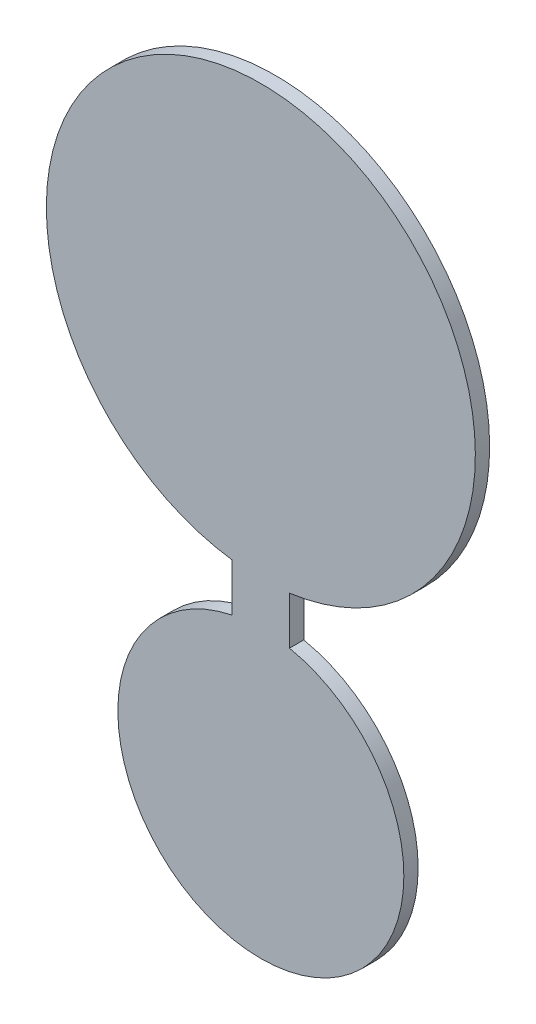
ISO-10303-21;
HEADER;
FILE_DESCRIPTION(('STEP AP214'),'2;1');
FILE_NAME('part.step','',(''),(''),'','','');
FILE_SCHEMA(('AUTOMOTIVE_DESIGN { 1 0 10303 214 1 1 1 1 }'));
ENDSEC;
DATA;
#1=APPLICATION_CONTEXT('core data for automotive mechanical design processes');
#2=APPLICATION_PROTOCOL_DEFINITION('international standard','automotive_design',2000,#1);
#3=PRODUCT_CONTEXT('',#1,'mechanical');
#4=PRODUCT('Part','Part','',(#3));
#5=PRODUCT_RELATED_PRODUCT_CATEGORY('part','',(#4));
#6=PRODUCT_DEFINITION_FORMATION('','',#4);
#7=PRODUCT_DEFINITION_CONTEXT('part definition',#1,'design');
#8=PRODUCT_DEFINITION('design','',#6,#7);
#9=PRODUCT_DEFINITION_SHAPE('','',#8);
#10=(LENGTH_UNIT() NAMED_UNIT(*) SI_UNIT(.MILLI.,.METRE.));
#11=(NAMED_UNIT(*) PLANE_ANGLE_UNIT() SI_UNIT($,.RADIAN.));
#12=(NAMED_UNIT(*) SI_UNIT($,.STERADIAN.) SOLID_ANGLE_UNIT());
#13=UNCERTAINTY_MEASURE_WITH_UNIT(LENGTH_MEASURE(1.E-05),#10,'distance_accuracy_value','');
#14=(GEOMETRIC_REPRESENTATION_CONTEXT(3) GLOBAL_UNCERTAINTY_ASSIGNED_CONTEXT((#13)) GLOBAL_UNIT_ASSIGNED_CONTEXT((#10,
#11,#12)) REPRESENTATION_CONTEXT('',''));
#15=CARTESIAN_POINT('',(0.,0.,0.));
#16=DIRECTION('',(0.,0.,1.));
#17=DIRECTION('',(1.,0.,0.));
#18=AXIS2_PLACEMENT_3D('',#15,#16,#17);
#19=CARTESIAN_POINT('',(-20.,0.,5.));
#20=DIRECTION('',(-1.,0.,0.));
#21=DIRECTION('',(0.,-1.,0.));
#22=AXIS2_PLACEMENT_3D('',#19,#20,#21);
#23=PLANE('',#22);
#24=DIRECTION('',(0.,1.,0.));
#25=VECTOR('',#24,1.);
#26=CARTESIAN_POINT('',(-20.,0.,-5.));
#27=LINE('',#26,#25);
#28=CARTESIAN_POINT('',(-20.,97.9795897113271,-5.));
#29=VERTEX_POINT('',#28);
#30=CARTESIAN_POINT('',(-20.,131.339312526815,-5.));
#31=VERTEX_POINT('',#30);
#32=EDGE_CURVE('E98',#29,#31,#27,.T.);
#33=ORIENTED_EDGE('',*,*,#32,.F.);
#34=DIRECTION('',(0.,0.,-1.));
#35=VECTOR('',#34,1.);
#36=CARTESIAN_POINT('',(-20.,97.9795897113271,5.));
#37=LINE('',#36,#35);
#38=CARTESIAN_POINT('',(-20.,97.9795897113271,5.));
#39=VERTEX_POINT('',#38);
#40=EDGE_CURVE('E11',#39,#29,#37,.T.);
#41=ORIENTED_EDGE('',*,*,#40,.F.);
#42=DIRECTION('',(0.,1.,0.));
#43=VECTOR('',#42,1.);
#44=CARTESIAN_POINT('',(-20.,0.,5.));
#45=LINE('',#44,#43);
#46=CARTESIAN_POINT('',(-20.,131.339312526815,5.));
#47=VERTEX_POINT('',#46);
#48=EDGE_CURVE('E86',#39,#47,#45,.T.);
#49=ORIENTED_EDGE('',*,*,#48,.T.);
#50=DIRECTION('',(0.,0.,-1.));
#51=VECTOR('',#50,1.);
#52=CARTESIAN_POINT('',(-20.,131.339312526815,5.));
#53=LINE('',#52,#51);
#54=EDGE_CURVE('E75',#47,#31,#53,.T.);
#55=ORIENTED_EDGE('',*,*,#54,.T.);
#56=EDGE_LOOP('',(#33,#41,#49,#55));
#57=FACE_BOUND('',#56,.T.);
#58=ADVANCED_FACE('F36',(#57),#23,.T.);
#59=CARTESIAN_POINT('',(0.,0.,5.));
#60=DIRECTION('',(0.,0.,-1.));
#61=DIRECTION('',(-1.,0.,0.));
#62=AXIS2_PLACEMENT_3D('',#59,#60,#61);
#63=CYLINDRICAL_SURFACE('',#62,100.);
#64=CARTESIAN_POINT('',(0.,0.,-5.));
#65=DIRECTION('',(0.,0.,1.));
#66=DIRECTION('',(1.,0.,0.));
#67=AXIS2_PLACEMENT_3D('',#64,#65,#66);
#68=CIRCLE('',#67,100.);
#69=CARTESIAN_POINT('',(20.,97.9795897113271,-5.));
#70=VERTEX_POINT('',#69);
#71=EDGE_CURVE('E91',#29,#70,#68,.T.);
#72=ORIENTED_EDGE('',*,*,#71,.T.);
#73=DIRECTION('',(0.,0.,-1.));
#74=VECTOR('',#73,1.);
#75=CARTESIAN_POINT('',(20.,97.9795897113271,5.));
#76=LINE('',#75,#74);
#77=CARTESIAN_POINT('',(20.,97.9795897113271,5.));
#78=VERTEX_POINT('',#77);
#79=EDGE_CURVE('E44',#78,#70,#76,.T.);
#80=ORIENTED_EDGE('',*,*,#79,.F.);
#81=CARTESIAN_POINT('',(0.,0.,5.));
#82=DIRECTION('',(0.,0.,1.));
#83=DIRECTION('',(1.,0.,0.));
#84=AXIS2_PLACEMENT_3D('',#81,#82,#83);
#85=CIRCLE('',#84,100.);
#86=EDGE_CURVE('E81',#39,#78,#85,.T.);
#87=ORIENTED_EDGE('',*,*,#86,.F.);
#88=ORIENTED_EDGE('',*,*,#40,.T.);
#89=EDGE_LOOP('',(#72,#80,#87,#88));
#90=FACE_BOUND('',#89,.T.);
#91=ADVANCED_FACE('F89',(#90),#63,.T.);
#92=CARTESIAN_POINT('',(20.,0.,5.));
#93=DIRECTION('',(-1.,0.,0.));
#94=DIRECTION('',(0.,-1.,0.));
#95=AXIS2_PLACEMENT_3D('',#92,#93,#94);
#96=PLANE('',#95);
#97=DIRECTION('',(0.,1.,0.));
#98=VECTOR('',#97,1.);
#99=CARTESIAN_POINT('',(20.,0.,-5.));
#100=LINE('',#99,#98);
#101=CARTESIAN_POINT('',(20.,131.339312526815,-5.));
#102=VERTEX_POINT('',#101);
#103=EDGE_CURVE('E68',#70,#102,#100,.T.);
#104=ORIENTED_EDGE('',*,*,#103,.T.);
#105=DIRECTION('',(0.,0.,-1.));
#106=VECTOR('',#105,1.);
#107=CARTESIAN_POINT('',(20.,131.339312526815,5.));
#108=LINE('',#107,#106);
#109=CARTESIAN_POINT('',(20.,131.339312526815,5.));
#110=VERTEX_POINT('',#109);
#111=EDGE_CURVE('E92',#110,#102,#108,.T.);
#112=ORIENTED_EDGE('',*,*,#111,.F.);
#113=DIRECTION('',(0.,1.,0.));
#114=VECTOR('',#113,1.);
#115=CARTESIAN_POINT('',(20.,0.,5.));
#116=LINE('',#115,#114);
#117=EDGE_CURVE('E85',#78,#110,#116,.T.);
#118=ORIENTED_EDGE('',*,*,#117,.F.);
#119=ORIENTED_EDGE('',*,*,#79,.T.);
#120=EDGE_LOOP('',(#104,#112,#118,#119));
#121=FACE_BOUND('',#120,.T.);
#122=ADVANCED_FACE('F93',(#121),#96,.F.);
#123=CARTESIAN_POINT('',(0.,280.,5.));
#124=DIRECTION('',(0.,0.,-1.));
#125=DIRECTION('',(-1.,0.,0.));
#126=AXIS2_PLACEMENT_3D('',#123,#124,#125);
#127=CYLINDRICAL_SURFACE('',#126,150.);
#128=CARTESIAN_POINT('',(0.,280.,-5.));
#129=DIRECTION('',(0.,0.,1.));
#130=DIRECTION('',(1.,0.,0.));
#131=AXIS2_PLACEMENT_3D('',#128,#129,#130);
#132=CIRCLE('',#131,150.);
#133=EDGE_CURVE('E103',#102,#31,#132,.T.);
#134=ORIENTED_EDGE('',*,*,#133,.T.);
#135=ORIENTED_EDGE('',*,*,#54,.F.);
#136=CARTESIAN_POINT('',(0.,280.,5.));
#137=DIRECTION('',(0.,0.,1.));
#138=DIRECTION('',(1.,0.,0.));
#139=AXIS2_PLACEMENT_3D('',#136,#137,#138);
#140=CIRCLE('',#139,150.);
#141=EDGE_CURVE('E52',#110,#47,#140,.T.);
#142=ORIENTED_EDGE('',*,*,#141,.F.);
#143=ORIENTED_EDGE('',*,*,#111,.T.);
#144=EDGE_LOOP('',(#134,#135,#142,#143));
#145=FACE_BOUND('',#144,.T.);
#146=ADVANCED_FACE('F108',(#145),#127,.T.);
#147=CARTESIAN_POINT('',(0.,0.,5.));
#148=DIRECTION('',(0.,0.,1.));
#149=DIRECTION('',(1.,0.,0.));
#150=AXIS2_PLACEMENT_3D('',#147,#148,#149);
#151=PLANE('',#150);
#152=ORIENTED_EDGE('',*,*,#48,.F.);
#153=ORIENTED_EDGE('',*,*,#86,.T.);
#154=ORIENTED_EDGE('',*,*,#117,.T.);
#155=ORIENTED_EDGE('',*,*,#141,.T.);
#156=EDGE_LOOP('',(#152,#153,#154,#155));
#157=FACE_BOUND('',#156,.T.);
#158=ADVANCED_FACE('F83',(#157),#151,.T.);
#159=CARTESIAN_POINT('',(0.,0.,-5.));
#160=DIRECTION('',(0.,0.,1.));
#161=DIRECTION('',(1.,0.,0.));
#162=AXIS2_PLACEMENT_3D('',#159,#160,#161);
#163=PLANE('',#162);
#164=ORIENTED_EDGE('',*,*,#32,.T.);
#165=ORIENTED_EDGE('',*,*,#133,.F.);
#166=ORIENTED_EDGE('',*,*,#103,.F.);
#167=ORIENTED_EDGE('',*,*,#71,.F.);
#168=EDGE_LOOP('',(#164,#165,#166,#167));
#169=FACE_BOUND('',#168,.T.);
#170=ADVANCED_FACE('F110',(#169),#163,.F.);
#171=CLOSED_SHELL('',(#58,#91,#122,#146,#158,#170));
#172=MANIFOLD_SOLID_BREP('B2',#171);
#173=ADVANCED_BREP_SHAPE_REPRESENTATION('',(#18,#172),#14);
#174=SHAPE_DEFINITION_REPRESENTATION(#9,#173);
ENDSEC;
END-ISO-10303-21;
